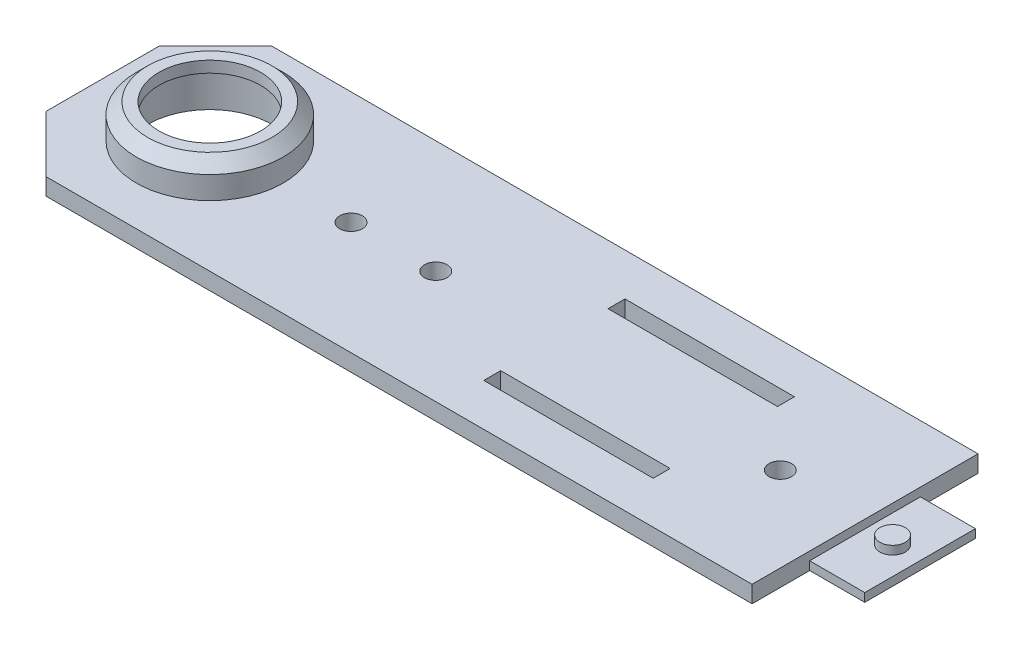
ISO-10303-21;
HEADER;
FILE_DESCRIPTION(('STEP AP214'),'2;1');
FILE_NAME('part.step','',(''),(''),'','','');
FILE_SCHEMA(('AUTOMOTIVE_DESIGN { 1 0 10303 214 1 1 1 1 }'));
ENDSEC;
DATA;
#1=APPLICATION_CONTEXT('core data for automotive mechanical design processes');
#2=APPLICATION_PROTOCOL_DEFINITION('international standard','automotive_design',2000,#1);
#3=PRODUCT_CONTEXT('',#1,'mechanical');
#4=PRODUCT('Part','Part','',(#3));
#5=PRODUCT_RELATED_PRODUCT_CATEGORY('part','',(#4));
#6=PRODUCT_DEFINITION_FORMATION('','',#4);
#7=PRODUCT_DEFINITION_CONTEXT('part definition',#1,'design');
#8=PRODUCT_DEFINITION('design','',#6,#7);
#9=PRODUCT_DEFINITION_SHAPE('','',#8);
#10=(LENGTH_UNIT() NAMED_UNIT(*) SI_UNIT(.MILLI.,.METRE.));
#11=(NAMED_UNIT(*) PLANE_ANGLE_UNIT() SI_UNIT($,.RADIAN.));
#12=(NAMED_UNIT(*) SI_UNIT($,.STERADIAN.) SOLID_ANGLE_UNIT());
#13=UNCERTAINTY_MEASURE_WITH_UNIT(LENGTH_MEASURE(1.E-05),#10,'distance_accuracy_value','');
#14=(GEOMETRIC_REPRESENTATION_CONTEXT(3) GLOBAL_UNCERTAINTY_ASSIGNED_CONTEXT((#13)) GLOBAL_UNIT_ASSIGNED_CONTEXT((#10,
#11,#12)) REPRESENTATION_CONTEXT('',''));
#15=CARTESIAN_POINT('',(0.,0.,0.));
#16=DIRECTION('',(0.,0.,1.));
#17=DIRECTION('',(1.,0.,0.));
#18=AXIS2_PLACEMENT_3D('',#15,#16,#17);
#19=CARTESIAN_POINT('',(77.25,3.,9.8));
#20=DIRECTION('',(0.,0.,-1.));
#21=DIRECTION('',(-1.,0.,0.));
#22=AXIS2_PLACEMENT_3D('',#19,#20,#21);
#23=PLANE('',#22);
#24=DIRECTION('',(1.,0.,0.));
#25=VECTOR('',#24,1.);
#26=CARTESIAN_POINT('',(77.25,1.5,9.8));
#27=LINE('',#26,#25);
#28=CARTESIAN_POINT('',(67.5,1.5,9.8));
#29=VERTEX_POINT('',#28);
#30=CARTESIAN_POINT('',(77.25,1.5,9.8));
#31=VERTEX_POINT('',#30);
#32=EDGE_CURVE('E173',#29,#31,#27,.T.);
#33=ORIENTED_EDGE('',*,*,#32,.F.);
#34=DIRECTION('',(0.,-1.,0.));
#35=VECTOR('',#34,1.);
#36=CARTESIAN_POINT('',(67.5,3.,9.8));
#37=LINE('',#36,#35);
#38=CARTESIAN_POINT('',(67.5,0.,9.8));
#39=VERTEX_POINT('',#38);
#40=EDGE_CURVE('E171',#29,#39,#37,.T.);
#41=ORIENTED_EDGE('',*,*,#40,.T.);
#42=DIRECTION('',(1.,0.,0.));
#43=VECTOR('',#42,1.);
#44=CARTESIAN_POINT('',(77.25,0.,9.8));
#45=LINE('',#44,#43);
#46=CARTESIAN_POINT('',(77.25,0.,9.8));
#47=VERTEX_POINT('',#46);
#48=EDGE_CURVE('E261',#39,#47,#45,.T.);
#49=ORIENTED_EDGE('',*,*,#48,.T.);
#50=DIRECTION('',(0.,-1.,0.));
#51=VECTOR('',#50,1.);
#52=CARTESIAN_POINT('',(77.25,3.,9.8));
#53=LINE('',#52,#51);
#54=EDGE_CURVE('E187',#31,#47,#53,.T.);
#55=ORIENTED_EDGE('',*,*,#54,.F.);
#56=EDGE_LOOP('',(#33,#41,#49,#55));
#57=FACE_BOUND('',#56,.T.);
#58=ADVANCED_FACE('F39',(#57),#23,.F.);
#59=CARTESIAN_POINT('',(77.25,3.,-9.8));
#60=DIRECTION('',(-1.,0.,0.));
#61=DIRECTION('',(0.,0.,1.));
#62=AXIS2_PLACEMENT_3D('',#59,#60,#61);
#63=PLANE('',#62);
#64=DIRECTION('',(0.,0.,-1.));
#65=VECTOR('',#64,1.);
#66=CARTESIAN_POINT('',(77.25,1.5,9.8));
#67=LINE('',#66,#65);
#68=CARTESIAN_POINT('',(77.25,1.5,-9.8));
#69=VERTEX_POINT('',#68);
#70=EDGE_CURVE('E55',#31,#69,#67,.T.);
#71=ORIENTED_EDGE('',*,*,#70,.F.);
#72=ORIENTED_EDGE('',*,*,#54,.T.);
#73=DIRECTION('',(0.,0.,-1.));
#74=VECTOR('',#73,1.);
#75=CARTESIAN_POINT('',(77.25,0.,-9.8));
#76=LINE('',#75,#74);
#77=CARTESIAN_POINT('',(77.25,0.,-9.8));
#78=VERTEX_POINT('',#77);
#79=EDGE_CURVE('E263',#47,#78,#76,.T.);
#80=ORIENTED_EDGE('',*,*,#79,.T.);
#81=DIRECTION('',(0.,-1.,0.));
#82=VECTOR('',#81,1.);
#83=CARTESIAN_POINT('',(77.25,3.,-9.8));
#84=LINE('',#83,#82);
#85=EDGE_CURVE('E184',#69,#78,#84,.T.);
#86=ORIENTED_EDGE('',*,*,#85,.F.);
#87=EDGE_LOOP('',(#71,#72,#80,#86));
#88=FACE_BOUND('',#87,.T.);
#89=ADVANCED_FACE('F393',(#88),#63,.F.);
#90=CARTESIAN_POINT('',(67.5,3.,-9.8));
#91=DIRECTION('',(0.,0.,1.));
#92=DIRECTION('',(1.,0.,0.));
#93=AXIS2_PLACEMENT_3D('',#90,#91,#92);
#94=PLANE('',#93);
#95=DIRECTION('',(-1.,0.,0.));
#96=VECTOR('',#95,1.);
#97=CARTESIAN_POINT('',(77.25,1.5,-9.8));
#98=LINE('',#97,#96);
#99=CARTESIAN_POINT('',(67.5,1.5,-9.8));
#100=VERTEX_POINT('',#99);
#101=EDGE_CURVE('E174',#69,#100,#98,.T.);
#102=ORIENTED_EDGE('',*,*,#101,.F.);
#103=ORIENTED_EDGE('',*,*,#85,.T.);
#104=DIRECTION('',(-1.,0.,0.));
#105=VECTOR('',#104,1.);
#106=CARTESIAN_POINT('',(67.5,0.,-9.8));
#107=LINE('',#106,#105);
#108=CARTESIAN_POINT('',(67.5,0.,-9.8));
#109=VERTEX_POINT('',#108);
#110=EDGE_CURVE('E182',#78,#109,#107,.T.);
#111=ORIENTED_EDGE('',*,*,#110,.T.);
#112=DIRECTION('',(0.,-1.,0.));
#113=VECTOR('',#112,1.);
#114=CARTESIAN_POINT('',(67.5,3.,-9.8));
#115=LINE('',#114,#113);
#116=EDGE_CURVE('E169',#100,#109,#115,.T.);
#117=ORIENTED_EDGE('',*,*,#116,.F.);
#118=EDGE_LOOP('',(#102,#103,#111,#117));
#119=FACE_BOUND('',#118,.T.);
#120=ADVANCED_FACE('F180',(#119),#94,.F.);
#121=CARTESIAN_POINT('',(0.,3.,0.));
#122=DIRECTION('',(0.,-1.,0.));
#123=DIRECTION('',(0.,0.,-1.));
#124=AXIS2_PLACEMENT_3D('',#121,#122,#123);
#125=PLANE('',#124);
#126=DIRECTION('',(0.,0.,-1.));
#127=VECTOR('',#126,1.);
#128=CARTESIAN_POINT('',(42.5,3.,12.5));
#129=LINE('',#128,#127);
#130=CARTESIAN_POINT('',(42.5,3.,12.5));
#131=VERTEX_POINT('',#130);
#132=CARTESIAN_POINT('',(42.5,3.,9.5));
#133=VERTEX_POINT('',#132);
#134=EDGE_CURVE('E344',#131,#133,#129,.T.);
#135=ORIENTED_EDGE('',*,*,#134,.F.);
#136=DIRECTION('',(1.,0.,0.));
#137=VECTOR('',#136,1.);
#138=CARTESIAN_POINT('',(12.5,3.,12.5));
#139=LINE('',#138,#137);
#140=CARTESIAN_POINT('',(12.5,3.,12.5));
#141=VERTEX_POINT('',#140);
#142=EDGE_CURVE('E340',#141,#131,#139,.T.);
#143=ORIENTED_EDGE('',*,*,#142,.F.);
#144=DIRECTION('',(0.,0.,1.));
#145=VECTOR('',#144,1.);
#146=CARTESIAN_POINT('',(12.5,3.,12.5));
#147=LINE('',#146,#145);
#148=CARTESIAN_POINT('',(12.5,3.,9.5));
#149=VERTEX_POINT('',#148);
#150=EDGE_CURVE('E356',#149,#141,#147,.T.);
#151=ORIENTED_EDGE('',*,*,#150,.F.);
#152=DIRECTION('',(-1.,0.,0.));
#153=VECTOR('',#152,1.);
#154=CARTESIAN_POINT('',(12.5,3.,9.5));
#155=LINE('',#154,#153);
#156=EDGE_CURVE('E359',#133,#149,#155,.T.);
#157=ORIENTED_EDGE('',*,*,#156,.F.);
#158=EDGE_LOOP('',(#135,#143,#151,#157));
#159=FACE_BOUND('',#158,.T.);
#160=DIRECTION('',(1.,0.,0.));
#161=VECTOR('',#160,1.);
#162=CARTESIAN_POINT('',(-67.5,3.,20.));
#163=LINE('',#162,#161);
#164=CARTESIAN_POINT('',(-57.5,3.,20.));
#165=VERTEX_POINT('',#164);
#166=CARTESIAN_POINT('',(67.5,3.,20.));
#167=VERTEX_POINT('',#166);
#168=EDGE_CURVE('E185',#165,#167,#163,.T.);
#169=ORIENTED_EDGE('',*,*,#168,.T.);
#170=DIRECTION('',(0.,0.,-1.));
#171=VECTOR('',#170,1.);
#172=CARTESIAN_POINT('',(67.5,3.,-9.8));
#173=LINE('',#172,#171);
#174=CARTESIAN_POINT('',(67.5,3.,-20.));
#175=VERTEX_POINT('',#174);
#176=EDGE_CURVE('E267',#167,#175,#173,.T.);
#177=ORIENTED_EDGE('',*,*,#176,.T.);
#178=DIRECTION('',(-1.,0.,0.));
#179=VECTOR('',#178,1.);
#180=CARTESIAN_POINT('',(-67.5,3.,-20.));
#181=LINE('',#180,#179);
#182=CARTESIAN_POINT('',(-57.5,3.,-20.));
#183=VERTEX_POINT('',#182);
#184=EDGE_CURVE('E268',#175,#183,#181,.T.);
#185=ORIENTED_EDGE('',*,*,#184,.T.);
#186=DIRECTION('',(0.707106781186548,0.,-0.707106781186547));
#187=VECTOR('',#186,1.);
#188=CARTESIAN_POINT('',(-67.5,3.,-10.));
#189=LINE('',#188,#187);
#190=CARTESIAN_POINT('',(-67.5,3.,-10.));
#191=VERTEX_POINT('',#190);
#192=EDGE_CURVE('E224',#183,#191,#189,.F.);
#193=ORIENTED_EDGE('',*,*,#192,.T.);
#194=DIRECTION('',(0.,0.,1.));
#195=VECTOR('',#194,1.);
#196=CARTESIAN_POINT('',(-67.5,3.,20.));
#197=LINE('',#196,#195);
#198=CARTESIAN_POINT('',(-67.5,3.,9.99999999999995));
#199=VERTEX_POINT('',#198);
#200=EDGE_CURVE('E190',#191,#199,#197,.T.);
#201=ORIENTED_EDGE('',*,*,#200,.T.);
#202=DIRECTION('',(-0.707106781186546,0.,-0.70710678118655));
#203=VECTOR('',#202,1.);
#204=CARTESIAN_POINT('',(-57.5,3.,20.));
#205=LINE('',#204,#203);
#206=EDGE_CURVE('E48',#199,#165,#205,.F.);
#207=ORIENTED_EDGE('',*,*,#206,.T.);
#208=EDGE_LOOP('',(#169,#177,#185,#193,#201,#207));
#209=FACE_BOUND('',#208,.T.);
#210=DIRECTION('',(0.,0.,-1.));
#211=VECTOR('',#210,1.);
#212=CARTESIAN_POINT('',(42.5,3.,-9.5));
#213=LINE('',#212,#211);
#214=CARTESIAN_POINT('',(42.5,3.,-9.5));
#215=VERTEX_POINT('',#214);
#216=CARTESIAN_POINT('',(42.5,3.,-12.5));
#217=VERTEX_POINT('',#216);
#218=EDGE_CURVE('E296',#215,#217,#213,.T.);
#219=ORIENTED_EDGE('',*,*,#218,.F.);
#220=DIRECTION('',(1.,0.,0.));
#221=VECTOR('',#220,1.);
#222=CARTESIAN_POINT('',(12.5,3.,-9.5));
#223=LINE('',#222,#221);
#224=CARTESIAN_POINT('',(12.5,3.,-9.5));
#225=VERTEX_POINT('',#224);
#226=EDGE_CURVE('E292',#225,#215,#223,.T.);
#227=ORIENTED_EDGE('',*,*,#226,.F.);
#228=DIRECTION('',(0.,0.,1.));
#229=VECTOR('',#228,1.);
#230=CARTESIAN_POINT('',(12.5,3.,-9.5));
#231=LINE('',#230,#229);
#232=CARTESIAN_POINT('',(12.5,3.,-12.5));
#233=VERTEX_POINT('',#232);
#234=EDGE_CURVE('E307',#233,#225,#231,.T.);
#235=ORIENTED_EDGE('',*,*,#234,.F.);
#236=DIRECTION('',(-1.,0.,0.));
#237=VECTOR('',#236,1.);
#238=CARTESIAN_POINT('',(12.5,3.,-12.5));
#239=LINE('',#238,#237);
#240=EDGE_CURVE('E310',#217,#233,#239,.T.);
#241=ORIENTED_EDGE('',*,*,#240,.F.);
#242=EDGE_LOOP('',(#219,#227,#235,#241));
#243=FACE_BOUND('',#242,.T.);
#244=CARTESIAN_POINT('',(-23.5,3.,0.));
#245=DIRECTION('',(0.,1.,0.));
#246=DIRECTION('',(0.,0.,1.));
#247=AXIS2_PLACEMENT_3D('',#244,#245,#246);
#248=CIRCLE('',#247,2.);
#249=CARTESIAN_POINT('',(-23.5,3.,2.));
#250=VERTEX_POINT('',#249);
#251=EDGE_CURVE('E305',#250,#250,#248,.T.);
#252=ORIENTED_EDGE('',*,*,#251,.F.);
#253=EDGE_LOOP('',(#252));
#254=FACE_BOUND('',#253,.T.);
#255=CARTESIAN_POINT('',(-8.5,3.,0.));
#256=DIRECTION('',(0.,1.,0.));
#257=DIRECTION('',(0.,0.,1.));
#258=AXIS2_PLACEMENT_3D('',#255,#256,#257);
#259=CIRCLE('',#258,2.);
#260=CARTESIAN_POINT('',(-8.5,3.,2.));
#261=VERTEX_POINT('',#260);
#262=EDGE_CURVE('E316',#261,#261,#259,.T.);
#263=ORIENTED_EDGE('',*,*,#262,.F.);
#264=EDGE_LOOP('',(#263));
#265=FACE_BOUND('',#264,.T.);
#266=CARTESIAN_POINT('',(52.5,3.,0.));
#267=DIRECTION('',(0.,1.,0.));
#268=DIRECTION('',(0.,0.,1.));
#269=AXIS2_PLACEMENT_3D('',#266,#267,#268);
#270=CIRCLE('',#269,2.);
#271=CARTESIAN_POINT('',(52.5,3.,2.));
#272=VERTEX_POINT('',#271);
#273=EDGE_CURVE('E322',#272,#272,#270,.T.);
#274=ORIENTED_EDGE('',*,*,#273,.F.);
#275=EDGE_LOOP('',(#274));
#276=FACE_BOUND('',#275,.T.);
#277=CARTESIAN_POINT('',(-48.5,3.,0.));
#278=DIRECTION('',(0.,-1.,0.));
#279=DIRECTION('',(0.,0.,-1.));
#280=AXIS2_PLACEMENT_3D('',#277,#278,#279);
#281=CIRCLE('',#280,13.);
#282=CARTESIAN_POINT('',(-48.5,3.,-13.));
#283=VERTEX_POINT('',#282);
#284=EDGE_CURVE('E203',#283,#283,#281,.F.);
#285=ORIENTED_EDGE('',*,*,#284,.F.);
#286=EDGE_LOOP('',(#285));
#287=FACE_BOUND('',#286,.T.);
#288=ADVANCED_FACE('F229',(#159,#209,#243,#254,#265,#276,#287),#125,.F.);
#289=CARTESIAN_POINT('',(0.,0.,0.));
#290=DIRECTION('',(0.,-1.,0.));
#291=DIRECTION('',(0.,0.,-1.));
#292=AXIS2_PLACEMENT_3D('',#289,#290,#291);
#293=PLANE('',#292);
#294=CARTESIAN_POINT('',(-8.5,0.,0.));
#295=DIRECTION('',(0.,1.,0.));
#296=DIRECTION('',(0.,0.,1.));
#297=AXIS2_PLACEMENT_3D('',#294,#295,#296);
#298=CIRCLE('',#297,2.);
#299=CARTESIAN_POINT('',(-8.5,0.,2.));
#300=VERTEX_POINT('',#299);
#301=EDGE_CURVE('E319',#300,#300,#298,.T.);
#302=ORIENTED_EDGE('',*,*,#301,.T.);
#303=EDGE_LOOP('',(#302));
#304=FACE_BOUND('',#303,.T.);
#305=DIRECTION('',(1.,0.,0.));
#306=VECTOR('',#305,1.);
#307=CARTESIAN_POINT('',(12.5,0.,-9.5));
#308=LINE('',#307,#306);
#309=CARTESIAN_POINT('',(12.5,0.,-9.5));
#310=VERTEX_POINT('',#309);
#311=CARTESIAN_POINT('',(42.5,0.,-9.5));
#312=VERTEX_POINT('',#311);
#313=EDGE_CURVE('E293',#310,#312,#308,.T.);
#314=ORIENTED_EDGE('',*,*,#313,.T.);
#315=DIRECTION('',(0.,0.,-1.));
#316=VECTOR('',#315,1.);
#317=CARTESIAN_POINT('',(42.5,0.,-9.5));
#318=LINE('',#317,#316);
#319=CARTESIAN_POINT('',(42.5,0.,-12.5));
#320=VERTEX_POINT('',#319);
#321=EDGE_CURVE('E303',#312,#320,#318,.T.);
#322=ORIENTED_EDGE('',*,*,#321,.T.);
#323=DIRECTION('',(-1.,0.,0.));
#324=VECTOR('',#323,1.);
#325=CARTESIAN_POINT('',(12.5,0.,-12.5));
#326=LINE('',#325,#324);
#327=CARTESIAN_POINT('',(12.5,0.,-12.5));
#328=VERTEX_POINT('',#327);
#329=EDGE_CURVE('E300',#320,#328,#326,.T.);
#330=ORIENTED_EDGE('',*,*,#329,.T.);
#331=DIRECTION('',(0.,0.,1.));
#332=VECTOR('',#331,1.);
#333=CARTESIAN_POINT('',(12.5,0.,-9.5));
#334=LINE('',#333,#332);
#335=EDGE_CURVE('E297',#328,#310,#334,.T.);
#336=ORIENTED_EDGE('',*,*,#335,.T.);
#337=EDGE_LOOP('',(#314,#322,#330,#336));
#338=FACE_BOUND('',#337,.T.);
#339=CARTESIAN_POINT('',(-48.5,0.,0.));
#340=DIRECTION('',(0.,1.,0.));
#341=DIRECTION('',(0.,0.,1.));
#342=AXIS2_PLACEMENT_3D('',#339,#340,#341);
#343=CIRCLE('',#342,11.);
#344=CARTESIAN_POINT('',(-48.5,0.,11.));
#345=VERTEX_POINT('',#344);
#346=EDGE_CURVE('E273',#345,#345,#343,.T.);
#347=ORIENTED_EDGE('',*,*,#346,.T.);
#348=EDGE_LOOP('',(#347));
#349=FACE_BOUND('',#348,.T.);
#350=DIRECTION('',(1.,0.,0.));
#351=VECTOR('',#350,1.);
#352=CARTESIAN_POINT('',(-67.5,0.,20.));
#353=LINE('',#352,#351);
#354=CARTESIAN_POINT('',(-57.5,0.,20.));
#355=VERTEX_POINT('',#354);
#356=CARTESIAN_POINT('',(67.5,0.,20.));
#357=VERTEX_POINT('',#356);
#358=EDGE_CURVE('E248',#355,#357,#353,.T.);
#359=ORIENTED_EDGE('',*,*,#358,.F.);
#360=DIRECTION('',(0.707106781186546,0.,0.70710678118655));
#361=VECTOR('',#360,1.);
#362=CARTESIAN_POINT('',(-38.7500000000002,0.,38.75));
#363=LINE('',#362,#361);
#364=CARTESIAN_POINT('',(-67.5,0.,9.99999999999995));
#365=VERTEX_POINT('',#364);
#366=EDGE_CURVE('E217',#355,#365,#363,.F.);
#367=ORIENTED_EDGE('',*,*,#366,.T.);
#368=DIRECTION('',(0.,0.,1.));
#369=VECTOR('',#368,1.);
#370=CARTESIAN_POINT('',(-67.5,0.,20.));
#371=LINE('',#370,#369);
#372=CARTESIAN_POINT('',(-67.5,0.,-10.));
#373=VERTEX_POINT('',#372);
#374=EDGE_CURVE('E246',#373,#365,#371,.T.);
#375=ORIENTED_EDGE('',*,*,#374,.F.);
#376=DIRECTION('',(-0.707106781186548,0.,0.707106781186547));
#377=VECTOR('',#376,1.);
#378=CARTESIAN_POINT('',(-38.7499999999999,0.,-38.75));
#379=LINE('',#378,#377);
#380=CARTESIAN_POINT('',(-57.5,0.,-20.));
#381=VERTEX_POINT('',#380);
#382=EDGE_CURVE('E215',#373,#381,#379,.F.);
#383=ORIENTED_EDGE('',*,*,#382,.T.);
#384=DIRECTION('',(-1.,0.,0.));
#385=VECTOR('',#384,1.);
#386=CARTESIAN_POINT('',(-67.5,0.,-20.));
#387=LINE('',#386,#385);
#388=CARTESIAN_POINT('',(67.5,0.,-20.));
#389=VERTEX_POINT('',#388);
#390=EDGE_CURVE('E252',#389,#381,#387,.T.);
#391=ORIENTED_EDGE('',*,*,#390,.F.);
#392=DIRECTION('',(0.,0.,-1.));
#393=VECTOR('',#392,1.);
#394=CARTESIAN_POINT('',(67.5,0.,-9.8));
#395=LINE('',#394,#393);
#396=EDGE_CURVE('E256',#109,#389,#395,.T.);
#397=ORIENTED_EDGE('',*,*,#396,.F.);
#398=ORIENTED_EDGE('',*,*,#110,.F.);
#399=ORIENTED_EDGE('',*,*,#79,.F.);
#400=ORIENTED_EDGE('',*,*,#48,.F.);
#401=DIRECTION('',(0.,0.,-1.));
#402=VECTOR('',#401,1.);
#403=CARTESIAN_POINT('',(67.5,0.,20.));
#404=LINE('',#403,#402);
#405=EDGE_CURVE('E254',#357,#39,#404,.T.);
#406=ORIENTED_EDGE('',*,*,#405,.F.);
#407=EDGE_LOOP('',(#359,#367,#375,#383,#391,#397,#398,#399,#400,#406));
#408=FACE_BOUND('',#407,.T.);
#409=CARTESIAN_POINT('',(-23.5,0.,0.));
#410=DIRECTION('',(0.,1.,0.));
#411=DIRECTION('',(0.,0.,1.));
#412=AXIS2_PLACEMENT_3D('',#409,#410,#411);
#413=CIRCLE('',#412,2.);
#414=CARTESIAN_POINT('',(-23.5,0.,2.));
#415=VERTEX_POINT('',#414);
#416=EDGE_CURVE('E313',#415,#415,#413,.T.);
#417=ORIENTED_EDGE('',*,*,#416,.T.);
#418=EDGE_LOOP('',(#417));
#419=FACE_BOUND('',#418,.T.);
#420=CARTESIAN_POINT('',(52.5,0.,0.));
#421=DIRECTION('',(0.,1.,0.));
#422=DIRECTION('',(0.,0.,1.));
#423=AXIS2_PLACEMENT_3D('',#420,#421,#422);
#424=CIRCLE('',#423,2.);
#425=CARTESIAN_POINT('',(52.5,0.,2.));
#426=VERTEX_POINT('',#425);
#427=EDGE_CURVE('E325',#426,#426,#424,.T.);
#428=ORIENTED_EDGE('',*,*,#427,.T.);
#429=EDGE_LOOP('',(#428));
#430=FACE_BOUND('',#429,.T.);
#431=DIRECTION('',(1.,0.,0.));
#432=VECTOR('',#431,1.);
#433=CARTESIAN_POINT('',(12.5,0.,12.5));
#434=LINE('',#433,#432);
#435=CARTESIAN_POINT('',(12.5,0.,12.5));
#436=VERTEX_POINT('',#435);
#437=CARTESIAN_POINT('',(42.5,0.,12.5));
#438=VERTEX_POINT('',#437);
#439=EDGE_CURVE('E341',#436,#438,#434,.T.);
#440=ORIENTED_EDGE('',*,*,#439,.T.);
#441=DIRECTION('',(0.,0.,-1.));
#442=VECTOR('',#441,1.);
#443=CARTESIAN_POINT('',(42.5,0.,12.5));
#444=LINE('',#443,#442);
#445=CARTESIAN_POINT('',(42.5,0.,9.5));
#446=VERTEX_POINT('',#445);
#447=EDGE_CURVE('E351',#438,#446,#444,.T.);
#448=ORIENTED_EDGE('',*,*,#447,.T.);
#449=DIRECTION('',(-1.,0.,0.));
#450=VECTOR('',#449,1.);
#451=CARTESIAN_POINT('',(12.5,0.,9.5));
#452=LINE('',#451,#450);
#453=CARTESIAN_POINT('',(12.5,0.,9.5));
#454=VERTEX_POINT('',#453);
#455=EDGE_CURVE('E348',#446,#454,#452,.T.);
#456=ORIENTED_EDGE('',*,*,#455,.T.);
#457=DIRECTION('',(0.,0.,1.));
#458=VECTOR('',#457,1.);
#459=CARTESIAN_POINT('',(12.5,0.,12.5));
#460=LINE('',#459,#458);
#461=EDGE_CURVE('E345',#454,#436,#460,.T.);
#462=ORIENTED_EDGE('',*,*,#461,.T.);
#463=EDGE_LOOP('',(#440,#448,#456,#462));
#464=FACE_BOUND('',#463,.T.);
#465=ADVANCED_FACE('F244',(#304,#338,#349,#408,#419,#430,#464),#293,.T.);
#466=CARTESIAN_POINT('',(-67.5,3.,-20.));
#467=DIRECTION('',(0.,0.,1.));
#468=DIRECTION('',(1.,0.,0.));
#469=AXIS2_PLACEMENT_3D('',#466,#467,#468);
#470=PLANE('',#469);
#471=ORIENTED_EDGE('',*,*,#390,.T.);
#472=DIRECTION('',(0.,1.,0.));
#473=VECTOR('',#472,1.);
#474=CARTESIAN_POINT('',(-57.5,3.,-20.));
#475=LINE('',#474,#473);
#476=EDGE_CURVE('E11',#381,#183,#475,.T.);
#477=ORIENTED_EDGE('',*,*,#476,.T.);
#478=ORIENTED_EDGE('',*,*,#184,.F.);
#479=DIRECTION('',(0.,-1.,0.));
#480=VECTOR('',#479,1.);
#481=CARTESIAN_POINT('',(67.5,3.,-20.));
#482=LINE('',#481,#480);
#483=EDGE_CURVE('E200',#175,#389,#482,.T.);
#484=ORIENTED_EDGE('',*,*,#483,.T.);
#485=EDGE_LOOP('',(#471,#477,#478,#484));
#486=FACE_BOUND('',#485,.T.);
#487=ADVANCED_FACE('F409',(#486),#470,.F.);
#488=CARTESIAN_POINT('',(-67.5,3.,20.));
#489=DIRECTION('',(1.,0.,0.));
#490=DIRECTION('',(0.,0.,-1.));
#491=AXIS2_PLACEMENT_3D('',#488,#489,#490);
#492=PLANE('',#491);
#493=ORIENTED_EDGE('',*,*,#374,.T.);
#494=DIRECTION('',(0.,1.,0.));
#495=VECTOR('',#494,1.);
#496=CARTESIAN_POINT('',(-67.5,3.,9.99999999999995));
#497=LINE('',#496,#495);
#498=EDGE_CURVE('E222',#365,#199,#497,.T.);
#499=ORIENTED_EDGE('',*,*,#498,.T.);
#500=ORIENTED_EDGE('',*,*,#200,.F.);
#501=DIRECTION('',(0.,-1.,0.));
#502=VECTOR('',#501,1.);
#503=CARTESIAN_POINT('',(-67.5,3.,-10.));
#504=LINE('',#503,#502);
#505=EDGE_CURVE('E219',#191,#373,#504,.T.);
#506=ORIENTED_EDGE('',*,*,#505,.T.);
#507=EDGE_LOOP('',(#493,#499,#500,#506));
#508=FACE_BOUND('',#507,.T.);
#509=ADVANCED_FACE('F250',(#508),#492,.F.);
#510=CARTESIAN_POINT('',(-67.5,3.,20.));
#511=DIRECTION('',(0.,0.,-1.));
#512=DIRECTION('',(-1.,0.,0.));
#513=AXIS2_PLACEMENT_3D('',#510,#511,#512);
#514=PLANE('',#513);
#515=ORIENTED_EDGE('',*,*,#168,.F.);
#516=DIRECTION('',(0.,-1.,0.));
#517=VECTOR('',#516,1.);
#518=CARTESIAN_POINT('',(-57.5,3.,20.));
#519=LINE('',#518,#517);
#520=EDGE_CURVE('E212',#165,#355,#519,.T.);
#521=ORIENTED_EDGE('',*,*,#520,.T.);
#522=ORIENTED_EDGE('',*,*,#358,.T.);
#523=DIRECTION('',(0.,-1.,0.));
#524=VECTOR('',#523,1.);
#525=CARTESIAN_POINT('',(67.5,3.,20.));
#526=LINE('',#525,#524);
#527=EDGE_CURVE('E197',#167,#357,#526,.T.);
#528=ORIENTED_EDGE('',*,*,#527,.F.);
#529=EDGE_LOOP('',(#515,#521,#522,#528));
#530=FACE_BOUND('',#529,.T.);
#531=ADVANCED_FACE('F238',(#530),#514,.F.);
#532=CARTESIAN_POINT('',(67.5,3.,20.));
#533=DIRECTION('',(-1.,0.,0.));
#534=DIRECTION('',(0.,0.,1.));
#535=AXIS2_PLACEMENT_3D('',#532,#533,#534);
#536=PLANE('',#535);
#537=ORIENTED_EDGE('',*,*,#405,.T.);
#538=ORIENTED_EDGE('',*,*,#40,.F.);
#539=DIRECTION('',(0.,0.,1.));
#540=VECTOR('',#539,1.);
#541=CARTESIAN_POINT('',(67.5,1.5,9.8));
#542=LINE('',#541,#540);
#543=EDGE_CURVE('E164',#100,#29,#542,.T.);
#544=ORIENTED_EDGE('',*,*,#543,.F.);
#545=ORIENTED_EDGE('',*,*,#116,.T.);
#546=ORIENTED_EDGE('',*,*,#396,.T.);
#547=ORIENTED_EDGE('',*,*,#483,.F.);
#548=ORIENTED_EDGE('',*,*,#176,.F.);
#549=ORIENTED_EDGE('',*,*,#527,.T.);
#550=EDGE_LOOP('',(#537,#538,#544,#545,#546,#547,#548,#549));
#551=FACE_BOUND('',#550,.T.);
#552=ADVANCED_FACE('F166',(#551),#536,.F.);
#553=CARTESIAN_POINT('',(-48.5,3.,0.));
#554=DIRECTION('',(0.,-1.,0.));
#555=DIRECTION('',(0.,0.,-1.));
#556=AXIS2_PLACEMENT_3D('',#553,#554,#555);
#557=CYLINDRICAL_SURFACE('',#556,11.);
#558=ORIENTED_EDGE('',*,*,#346,.F.);
#559=EDGE_LOOP('',(#558));
#560=FACE_BOUND('',#559,.T.);
#561=CARTESIAN_POINT('',(-48.5,7.,0.));
#562=DIRECTION('',(0.,1.,0.));
#563=DIRECTION('',(0.,0.,1.));
#564=AXIS2_PLACEMENT_3D('',#561,#562,#563);
#565=CIRCLE('',#564,11.);
#566=CARTESIAN_POINT('',(-48.5,7.,11.));
#567=VERTEX_POINT('',#566);
#568=EDGE_CURVE('E354',#567,#567,#565,.T.);
#569=ORIENTED_EDGE('',*,*,#568,.T.);
#570=EDGE_LOOP('',(#569));
#571=FACE_BOUND('',#570,.T.);
#572=ADVANCED_FACE('F404',(#560,#571),#557,.F.);
#573=CARTESIAN_POINT('',(42.5,3.,-9.5));
#574=DIRECTION('',(-1.,0.,0.));
#575=DIRECTION('',(0.,0.,1.));
#576=AXIS2_PLACEMENT_3D('',#573,#574,#575);
#577=PLANE('',#576);
#578=ORIENTED_EDGE('',*,*,#321,.F.);
#579=DIRECTION('',(0.,-1.,0.));
#580=VECTOR('',#579,1.);
#581=CARTESIAN_POINT('',(42.5,3.,-9.5));
#582=LINE('',#581,#580);
#583=EDGE_CURVE('E289',#215,#312,#582,.T.);
#584=ORIENTED_EDGE('',*,*,#583,.F.);
#585=ORIENTED_EDGE('',*,*,#218,.T.);
#586=DIRECTION('',(0.,-1.,0.));
#587=VECTOR('',#586,1.);
#588=CARTESIAN_POINT('',(42.5,3.,-12.5));
#589=LINE('',#588,#587);
#590=EDGE_CURVE('E277',#217,#320,#589,.T.);
#591=ORIENTED_EDGE('',*,*,#590,.T.);
#592=EDGE_LOOP('',(#578,#584,#585,#591));
#593=FACE_BOUND('',#592,.T.);
#594=ADVANCED_FACE('F517',(#593),#577,.T.);
#595=CARTESIAN_POINT('',(12.5,3.,-12.5));
#596=DIRECTION('',(0.,0.,1.));
#597=DIRECTION('',(1.,0.,0.));
#598=AXIS2_PLACEMENT_3D('',#595,#596,#597);
#599=PLANE('',#598);
#600=ORIENTED_EDGE('',*,*,#329,.F.);
#601=ORIENTED_EDGE('',*,*,#590,.F.);
#602=ORIENTED_EDGE('',*,*,#240,.T.);
#603=DIRECTION('',(0.,-1.,0.));
#604=VECTOR('',#603,1.);
#605=CARTESIAN_POINT('',(12.5,3.,-12.5));
#606=LINE('',#605,#604);
#607=EDGE_CURVE('E281',#233,#328,#606,.T.);
#608=ORIENTED_EDGE('',*,*,#607,.T.);
#609=EDGE_LOOP('',(#600,#601,#602,#608));
#610=FACE_BOUND('',#609,.T.);
#611=ADVANCED_FACE('F531',(#610),#599,.T.);
#612=CARTESIAN_POINT('',(12.5,3.,-9.5));
#613=DIRECTION('',(1.,0.,0.));
#614=DIRECTION('',(0.,0.,-1.));
#615=AXIS2_PLACEMENT_3D('',#612,#613,#614);
#616=PLANE('',#615);
#617=ORIENTED_EDGE('',*,*,#335,.F.);
#618=ORIENTED_EDGE('',*,*,#607,.F.);
#619=ORIENTED_EDGE('',*,*,#234,.T.);
#620=DIRECTION('',(0.,-1.,0.));
#621=VECTOR('',#620,1.);
#622=CARTESIAN_POINT('',(12.5,3.,-9.5));
#623=LINE('',#622,#621);
#624=EDGE_CURVE('E285',#225,#310,#623,.T.);
#625=ORIENTED_EDGE('',*,*,#624,.T.);
#626=EDGE_LOOP('',(#617,#618,#619,#625));
#627=FACE_BOUND('',#626,.T.);
#628=ADVANCED_FACE('F541',(#627),#616,.T.);
#629=CARTESIAN_POINT('',(12.5,3.,-9.5));
#630=DIRECTION('',(0.,0.,-1.));
#631=DIRECTION('',(-1.,0.,0.));
#632=AXIS2_PLACEMENT_3D('',#629,#630,#631);
#633=PLANE('',#632);
#634=ORIENTED_EDGE('',*,*,#313,.F.);
#635=ORIENTED_EDGE('',*,*,#624,.F.);
#636=ORIENTED_EDGE('',*,*,#226,.T.);
#637=ORIENTED_EDGE('',*,*,#583,.T.);
#638=EDGE_LOOP('',(#634,#635,#636,#637));
#639=FACE_BOUND('',#638,.T.);
#640=ADVANCED_FACE('F552',(#639),#633,.T.);
#641=CARTESIAN_POINT('',(-23.5,3.,0.));
#642=DIRECTION('',(0.,-1.,0.));
#643=DIRECTION('',(0.,0.,-1.));
#644=AXIS2_PLACEMENT_3D('',#641,#642,#643);
#645=CYLINDRICAL_SURFACE('',#644,2.);
#646=ORIENTED_EDGE('',*,*,#251,.T.);
#647=EDGE_LOOP('',(#646));
#648=FACE_BOUND('',#647,.T.);
#649=ORIENTED_EDGE('',*,*,#416,.F.);
#650=EDGE_LOOP('',(#649));
#651=FACE_BOUND('',#650,.T.);
#652=ADVANCED_FACE('F563',(#648,#651),#645,.F.);
#653=CARTESIAN_POINT('',(-8.5,3.,0.));
#654=DIRECTION('',(0.,-1.,0.));
#655=DIRECTION('',(0.,0.,-1.));
#656=AXIS2_PLACEMENT_3D('',#653,#654,#655);
#657=CYLINDRICAL_SURFACE('',#656,2.);
#658=ORIENTED_EDGE('',*,*,#262,.T.);
#659=EDGE_LOOP('',(#658));
#660=FACE_BOUND('',#659,.T.);
#661=ORIENTED_EDGE('',*,*,#301,.F.);
#662=EDGE_LOOP('',(#661));
#663=FACE_BOUND('',#662,.T.);
#664=ADVANCED_FACE('F574',(#660,#663),#657,.F.);
#665=CARTESIAN_POINT('',(52.5,3.,0.));
#666=DIRECTION('',(0.,-1.,0.));
#667=DIRECTION('',(0.,0.,-1.));
#668=AXIS2_PLACEMENT_3D('',#665,#666,#667);
#669=CYLINDRICAL_SURFACE('',#668,2.);
#670=ORIENTED_EDGE('',*,*,#273,.T.);
#671=EDGE_LOOP('',(#670));
#672=FACE_BOUND('',#671,.T.);
#673=ORIENTED_EDGE('',*,*,#427,.F.);
#674=EDGE_LOOP('',(#673));
#675=FACE_BOUND('',#674,.T.);
#676=ADVANCED_FACE('F585',(#672,#675),#669,.F.);
#677=CARTESIAN_POINT('',(42.5,3.,12.5));
#678=DIRECTION('',(-1.,0.,0.));
#679=DIRECTION('',(0.,0.,1.));
#680=AXIS2_PLACEMENT_3D('',#677,#678,#679);
#681=PLANE('',#680);
#682=ORIENTED_EDGE('',*,*,#447,.F.);
#683=DIRECTION('',(0.,-1.,0.));
#684=VECTOR('',#683,1.);
#685=CARTESIAN_POINT('',(42.5,3.,12.5));
#686=LINE('',#685,#684);
#687=EDGE_CURVE('E337',#131,#438,#686,.T.);
#688=ORIENTED_EDGE('',*,*,#687,.F.);
#689=ORIENTED_EDGE('',*,*,#134,.T.);
#690=DIRECTION('',(0.,-1.,0.));
#691=VECTOR('',#690,1.);
#692=CARTESIAN_POINT('',(42.5,3.,9.5));
#693=LINE('',#692,#691);
#694=EDGE_CURVE('E328',#133,#446,#693,.T.);
#695=ORIENTED_EDGE('',*,*,#694,.T.);
#696=EDGE_LOOP('',(#682,#688,#689,#695));
#697=FACE_BOUND('',#696,.T.);
#698=ADVANCED_FACE('F596',(#697),#681,.T.);
#699=CARTESIAN_POINT('',(12.5,3.,9.5));
#700=DIRECTION('',(0.,0.,1.));
#701=DIRECTION('',(1.,0.,0.));
#702=AXIS2_PLACEMENT_3D('',#699,#700,#701);
#703=PLANE('',#702);
#704=ORIENTED_EDGE('',*,*,#455,.F.);
#705=ORIENTED_EDGE('',*,*,#694,.F.);
#706=ORIENTED_EDGE('',*,*,#156,.T.);
#707=DIRECTION('',(0.,-1.,0.));
#708=VECTOR('',#707,1.);
#709=CARTESIAN_POINT('',(12.5,3.,9.5));
#710=LINE('',#709,#708);
#711=EDGE_CURVE('E333',#149,#454,#710,.T.);
#712=ORIENTED_EDGE('',*,*,#711,.T.);
#713=EDGE_LOOP('',(#704,#705,#706,#712));
#714=FACE_BOUND('',#713,.T.);
#715=ADVANCED_FACE('F607',(#714),#703,.T.);
#716=CARTESIAN_POINT('',(12.5,3.,12.5));
#717=DIRECTION('',(1.,0.,0.));
#718=DIRECTION('',(0.,0.,-1.));
#719=AXIS2_PLACEMENT_3D('',#716,#717,#718);
#720=PLANE('',#719);
#721=ORIENTED_EDGE('',*,*,#461,.F.);
#722=ORIENTED_EDGE('',*,*,#711,.F.);
#723=ORIENTED_EDGE('',*,*,#150,.T.);
#724=DIRECTION('',(0.,-1.,0.));
#725=VECTOR('',#724,1.);
#726=CARTESIAN_POINT('',(12.5,3.,12.5));
#727=LINE('',#726,#725);
#728=EDGE_CURVE('E335',#141,#436,#727,.T.);
#729=ORIENTED_EDGE('',*,*,#728,.T.);
#730=EDGE_LOOP('',(#721,#722,#723,#729));
#731=FACE_BOUND('',#730,.T.);
#732=ADVANCED_FACE('F618',(#731),#720,.T.);
#733=CARTESIAN_POINT('',(12.5,3.,12.5));
#734=DIRECTION('',(0.,0.,-1.));
#735=DIRECTION('',(-1.,0.,0.));
#736=AXIS2_PLACEMENT_3D('',#733,#734,#735);
#737=PLANE('',#736);
#738=ORIENTED_EDGE('',*,*,#439,.F.);
#739=ORIENTED_EDGE('',*,*,#728,.F.);
#740=ORIENTED_EDGE('',*,*,#142,.T.);
#741=ORIENTED_EDGE('',*,*,#687,.T.);
#742=EDGE_LOOP('',(#738,#739,#740,#741));
#743=FACE_BOUND('',#742,.T.);
#744=ADVANCED_FACE('F629',(#743),#737,.T.);
#745=CARTESIAN_POINT('',(-48.5,7.,0.));
#746=DIRECTION('',(0.,-1.,0.));
#747=DIRECTION('',(0.,0.,-1.));
#748=AXIS2_PLACEMENT_3D('',#745,#746,#747);
#749=CYLINDRICAL_SURFACE('',#748,13.);
#750=CARTESIAN_POINT('',(-48.5,7.00000000000001,0.));
#751=DIRECTION('',(0.,1.,0.));
#752=DIRECTION('',(0.,0.,1.));
#753=AXIS2_PLACEMENT_3D('',#750,#751,#752);
#754=CIRCLE('',#753,13.);
#755=CARTESIAN_POINT('',(-48.5,7.00000000000001,13.));
#756=VERTEX_POINT('',#755);
#757=EDGE_CURVE('E209',#756,#756,#754,.F.);
#758=ORIENTED_EDGE('',*,*,#757,.T.);
#759=EDGE_LOOP('',(#758));
#760=FACE_BOUND('',#759,.T.);
#761=ORIENTED_EDGE('',*,*,#284,.T.);
#762=EDGE_LOOP('',(#761));
#763=FACE_BOUND('',#762,.T.);
#764=ADVANCED_FACE('F638',(#760,#763),#749,.T.);
#765=CARTESIAN_POINT('',(-48.5,7.,0.));
#766=DIRECTION('',(0.,1.,0.));
#767=DIRECTION('',(0.,0.,1.));
#768=AXIS2_PLACEMENT_3D('',#765,#766,#767);
#769=PLANE('',#768);
#770=CARTESIAN_POINT('',(-48.5,7.,0.));
#771=DIRECTION('',(0.,1.,0.));
#772=DIRECTION('',(0.,0.,1.));
#773=AXIS2_PLACEMENT_3D('',#770,#771,#772);
#774=CIRCLE('',#773,9.);
#775=CARTESIAN_POINT('',(-48.5,7.,9.));
#776=VERTEX_POINT('',#775);
#777=EDGE_CURVE('E365',#776,#776,#774,.T.);
#778=ORIENTED_EDGE('',*,*,#777,.T.);
#779=EDGE_LOOP('',(#778));
#780=FACE_BOUND('',#779,.T.);
#781=ORIENTED_EDGE('',*,*,#568,.F.);
#782=EDGE_LOOP('',(#781));
#783=FACE_BOUND('',#782,.T.);
#784=ADVANCED_FACE('F650',(#780,#783),#769,.F.);
#785=CARTESIAN_POINT('',(-48.5,9.,0.));
#786=DIRECTION('',(0.,1.,0.));
#787=DIRECTION('',(0.,0.,1.));
#788=AXIS2_PLACEMENT_3D('',#785,#786,#787);
#789=PLANE('',#788);
#790=CARTESIAN_POINT('',(-48.5,9.,0.));
#791=DIRECTION('',(0.,1.,0.));
#792=DIRECTION('',(0.,0.,1.));
#793=AXIS2_PLACEMENT_3D('',#790,#791,#792);
#794=CIRCLE('',#793,11.);
#795=CARTESIAN_POINT('',(-48.5,9.,11.));
#796=VERTEX_POINT('',#795);
#797=EDGE_CURVE('E206',#796,#796,#794,.T.);
#798=ORIENTED_EDGE('',*,*,#797,.T.);
#799=EDGE_LOOP('',(#798));
#800=FACE_BOUND('',#799,.T.);
#801=CARTESIAN_POINT('',(-48.5,9.,0.));
#802=DIRECTION('',(0.,1.,0.));
#803=DIRECTION('',(0.,0.,1.));
#804=AXIS2_PLACEMENT_3D('',#801,#802,#803);
#805=CIRCLE('',#804,9.);
#806=CARTESIAN_POINT('',(-48.5,9.,9.));
#807=VERTEX_POINT('',#806);
#808=EDGE_CURVE('E364',#807,#807,#805,.T.);
#809=ORIENTED_EDGE('',*,*,#808,.F.);
#810=EDGE_LOOP('',(#809));
#811=FACE_BOUND('',#810,.T.);
#812=ADVANCED_FACE('F655',(#800,#811),#789,.T.);
#813=CARTESIAN_POINT('',(-48.5,9.,0.));
#814=DIRECTION('',(0.,-1.,0.));
#815=DIRECTION('',(0.,0.,-1.));
#816=AXIS2_PLACEMENT_3D('',#813,#814,#815);
#817=CYLINDRICAL_SURFACE('',#816,9.);
#818=ORIENTED_EDGE('',*,*,#808,.T.);
#819=EDGE_LOOP('',(#818));
#820=FACE_BOUND('',#819,.T.);
#821=ORIENTED_EDGE('',*,*,#777,.F.);
#822=EDGE_LOOP('',(#821));
#823=FACE_BOUND('',#822,.T.);
#824=ADVANCED_FACE('F418',(#820,#823),#817,.F.);
#825=CARTESIAN_POINT('',(-48.5,9.,0.));
#826=DIRECTION('',(0.,-1.,0.));
#827=DIRECTION('',(0.,0.,-1.));
#828=AXIS2_PLACEMENT_3D('',#825,#826,#827);
#829=CONICAL_SURFACE('',#828,11.,0.785398163397447);
#830=ORIENTED_EDGE('',*,*,#757,.F.);
#831=EDGE_LOOP('',(#830));
#832=FACE_BOUND('',#831,.T.);
#833=ORIENTED_EDGE('',*,*,#797,.F.);
#834=EDGE_LOOP('',(#833));
#835=FACE_BOUND('',#834,.T.);
#836=ADVANCED_FACE('F413',(#832,#835),#829,.T.);
#837=CARTESIAN_POINT('',(-57.5,3.,20.));
#838=DIRECTION('',(0.70710678118655,0.,-0.707106781186546));
#839=DIRECTION('',(0.,-1.,0.));
#840=AXIS2_PLACEMENT_3D('',#837,#838,#839);
#841=PLANE('',#840);
#842=ORIENTED_EDGE('',*,*,#206,.F.);
#843=ORIENTED_EDGE('',*,*,#498,.F.);
#844=ORIENTED_EDGE('',*,*,#366,.F.);
#845=ORIENTED_EDGE('',*,*,#520,.F.);
#846=EDGE_LOOP('',(#842,#843,#844,#845));
#847=FACE_BOUND('',#846,.T.);
#848=ADVANCED_FACE('F240',(#847),#841,.F.);
#849=CARTESIAN_POINT('',(-67.5,3.,-10.));
#850=DIRECTION('',(0.707106781186547,0.,0.707106781186548));
#851=DIRECTION('',(0.,-1.,0.));
#852=AXIS2_PLACEMENT_3D('',#849,#850,#851);
#853=PLANE('',#852);
#854=ORIENTED_EDGE('',*,*,#192,.F.);
#855=ORIENTED_EDGE('',*,*,#476,.F.);
#856=ORIENTED_EDGE('',*,*,#382,.F.);
#857=ORIENTED_EDGE('',*,*,#505,.F.);
#858=EDGE_LOOP('',(#854,#855,#856,#857));
#859=FACE_BOUND('',#858,.T.);
#860=ADVANCED_FACE('F42',(#859),#853,.F.);
#861=CARTESIAN_POINT('',(0.,1.5,0.));
#862=DIRECTION('',(0.,1.,0.));
#863=DIRECTION('',(0.,0.,1.));
#864=AXIS2_PLACEMENT_3D('',#861,#862,#863);
#865=PLANE('',#864);
#866=CARTESIAN_POINT('',(72.375,1.5,0.));
#867=DIRECTION('',(0.,1.,0.));
#868=DIRECTION('',(0.,0.,1.));
#869=AXIS2_PLACEMENT_3D('',#866,#867,#868);
#870=CIRCLE('',#869,2.25);
#871=CARTESIAN_POINT('',(72.375,1.5,2.25));
#872=VERTEX_POINT('',#871);
#873=EDGE_CURVE('E372',#872,#872,#870,.T.);
#874=ORIENTED_EDGE('',*,*,#873,.F.);
#875=EDGE_LOOP('',(#874));
#876=FACE_BOUND('',#875,.T.);
#877=ORIENTED_EDGE('',*,*,#70,.T.);
#878=ORIENTED_EDGE('',*,*,#101,.T.);
#879=ORIENTED_EDGE('',*,*,#543,.T.);
#880=ORIENTED_EDGE('',*,*,#32,.T.);
#881=EDGE_LOOP('',(#877,#878,#879,#880));
#882=FACE_BOUND('',#881,.T.);
#883=ADVANCED_FACE('F176',(#876,#882),#865,.T.);
#884=CARTESIAN_POINT('',(72.375,1.5,0.));
#885=DIRECTION('',(0.,1.,0.));
#886=DIRECTION('',(0.,0.,1.));
#887=AXIS2_PLACEMENT_3D('',#884,#885,#886);
#888=CYLINDRICAL_SURFACE('',#887,2.25);
#889=ORIENTED_EDGE('',*,*,#873,.T.);
#890=EDGE_LOOP('',(#889));
#891=FACE_BOUND('',#890,.T.);
#892=CARTESIAN_POINT('',(72.375,3.,0.));
#893=DIRECTION('',(0.,1.,0.));
#894=DIRECTION('',(0.,0.,1.));
#895=AXIS2_PLACEMENT_3D('',#892,#893,#894);
#896=CIRCLE('',#895,2.25);
#897=CARTESIAN_POINT('',(72.375,3.,2.25));
#898=VERTEX_POINT('',#897);
#899=EDGE_CURVE('E373',#898,#898,#896,.T.);
#900=ORIENTED_EDGE('',*,*,#899,.F.);
#901=EDGE_LOOP('',(#900));
#902=FACE_BOUND('',#901,.T.);
#903=ADVANCED_FACE('F379',(#891,#902),#888,.T.);
#904=ORIENTED_EDGE('',*,*,#899,.T.);
#905=EDGE_LOOP('',(#904));
#906=FACE_BOUND('',#905,.T.);
#907=ADVANCED_FACE('F388',(#906),#125,.F.);
#908=CLOSED_SHELL('',(#58,#89,#120,#288,#465,#487,#509,#531,#552,#572,#594,#611,#628,#640,#652,
#664,#676,#698,#715,#732,#744,#764,#784,#812,#824,#836,#848,#860,#883,#903,#907));
#909=MANIFOLD_SOLID_BREP('B2',#908);
#910=ADVANCED_BREP_SHAPE_REPRESENTATION('',(#18,#909),#14);
#911=SHAPE_DEFINITION_REPRESENTATION(#9,#910);
ENDSEC;
END-ISO-10303-21;
